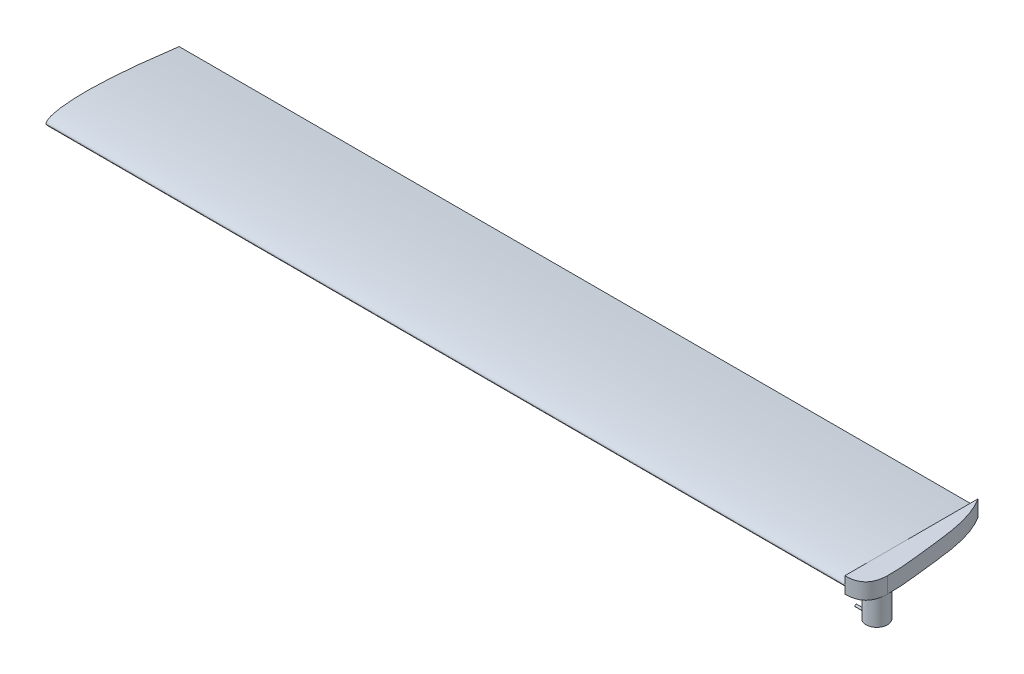
ISO-10303-21;
HEADER;
FILE_DESCRIPTION(('STEP AP214'),'2;1');
FILE_NAME('part.step','',(''),(''),'','','');
FILE_SCHEMA(('AUTOMOTIVE_DESIGN { 1 0 10303 214 1 1 1 1 }'));
ENDSEC;
DATA;
#1=APPLICATION_CONTEXT('core data for automotive mechanical design processes');
#2=APPLICATION_PROTOCOL_DEFINITION('international standard','automotive_design',2000,#1);
#3=PRODUCT_CONTEXT('',#1,'mechanical');
#4=PRODUCT('Part','Part','',(#3));
#5=PRODUCT_RELATED_PRODUCT_CATEGORY('part','',(#4));
#6=PRODUCT_DEFINITION_FORMATION('','',#4);
#7=PRODUCT_DEFINITION_CONTEXT('part definition',#1,'design');
#8=PRODUCT_DEFINITION('design','',#6,#7);
#9=PRODUCT_DEFINITION_SHAPE('','',#8);
#10=(LENGTH_UNIT() NAMED_UNIT(*) SI_UNIT(.MILLI.,.METRE.));
#11=(NAMED_UNIT(*) PLANE_ANGLE_UNIT() SI_UNIT($,.RADIAN.));
#12=(NAMED_UNIT(*) SI_UNIT($,.STERADIAN.) SOLID_ANGLE_UNIT());
#13=UNCERTAINTY_MEASURE_WITH_UNIT(LENGTH_MEASURE(1.E-05),#10,'distance_accuracy_value','');
#14=(GEOMETRIC_REPRESENTATION_CONTEXT(3) GLOBAL_UNCERTAINTY_ASSIGNED_CONTEXT((#13)) GLOBAL_UNIT_ASSIGNED_CONTEXT((#10,
#11,#12)) REPRESENTATION_CONTEXT('',''));
#15=CARTESIAN_POINT('',(0.,0.,0.));
#16=DIRECTION('',(0.,0.,1.));
#17=DIRECTION('',(1.,0.,0.));
#18=AXIS2_PLACEMENT_3D('',#15,#16,#17);
#19=CARTESIAN_POINT('',(750.,7.69748541026481,-124.995841148639));
#20=CARTESIAN_POINT('',(750.,8.13297079806969,-121.549441339967));
#21=CARTESIAN_POINT('',(750.,8.8711094317515,-115.707865670304));
#22=CARTESIAN_POINT('',(750.,10.001168495884,-106.612829462784));
#23=CARTESIAN_POINT('',(750.,10.900080960327,-98.7766774485687));
#24=CARTESIAN_POINT('',(750.,11.7180797430692,-91.0104309827742));
#25=CARTESIAN_POINT('',(750.,12.374421583348,-84.4661711660079));
#26=CARTESIAN_POINT('',(750.,13.0108919100097,-77.1231270334049));
#27=CARTESIAN_POINT('',(750.,13.6615586610674,-70.096902966347));
#28=CARTESIAN_POINT('',(750.,14.0382624320619,-63.2321869691896));
#29=CARTESIAN_POINT('',(750.,14.4586464854716,-56.9511833567442));
#30=CARTESIAN_POINT('',(750.,14.7447792836539,-50.1830543119707));
#31=CARTESIAN_POINT('',(750.,14.9288477277546,-43.7131494322692));
#32=CARTESIAN_POINT('',(750.,14.9867694495661,-38.0167473663419));
#33=CARTESIAN_POINT('',(750.,14.9641673572682,-31.8671085177231));
#34=CARTESIAN_POINT('',(750.,14.7641718889759,-25.9611084011886));
#35=CARTESIAN_POINT('',(750.,14.3189228100668,-20.4184783683121));
#36=CARTESIAN_POINT('',(750.,13.9020772787466,-16.0808939192611));
#37=CARTESIAN_POINT('',(750.,13.2766805127196,-11.948417440773));
#38=CARTESIAN_POINT('',(750.,12.4387478677314,-7.87202213430819));
#39=CARTESIAN_POINT('',(750.,11.4815907628938,-4.55145990959005));
#40=CARTESIAN_POINT('',(750.,10.1896156908138,-1.93507828303653));
#41=CARTESIAN_POINT('',(750.,8.86775259773538,-0.419790589282026));
#42=CARTESIAN_POINT('',(750.,7.67644804525767,0.11632820232294));
#43=CARTESIAN_POINT('',(750.,6.57571630783656,-0.228543288672665));
#44=CARTESIAN_POINT('',(750.,5.38282804272362,-1.09205976929891));
#45=CARTESIAN_POINT('',(750.,4.18267580665148,-3.12132983163146));
#46=CARTESIAN_POINT('',(750.,3.12236016112023,-5.83394586751756));
#47=CARTESIAN_POINT('',(750.,2.33803973933592,-8.96942484585597));
#48=CARTESIAN_POINT('',(750.,1.63555506566896,-12.4549344479186));
#49=CARTESIAN_POINT('',(750.,1.0576222452614,-16.3980412905516));
#50=CARTESIAN_POINT('',(750.,0.619305341649041,-20.4073734698152));
#51=CARTESIAN_POINT('',(750.,0.31851410484638,-24.9404968445985));
#52=CARTESIAN_POINT('',(750.,0.0979146932351296,-28.9969109003526));
#53=CARTESIAN_POINT('',(750.,0.0649508194327663,-33.6403576750407));
#54=CARTESIAN_POINT('',(750.,-0.00877400175199696,-37.6198248379226));
#55=CARTESIAN_POINT('',(750.,0.015166900275881,-42.1302311610639));
#56=CARTESIAN_POINT('',(750.,0.12809961974748,-46.8254786090486));
#57=CARTESIAN_POINT('',(750.,0.308197082911385,-52.0592292594811));
#58=CARTESIAN_POINT('',(750.,0.566048003035137,-57.5702731705481));
#59=CARTESIAN_POINT('',(750.,0.903534980744857,-63.0665569396856));
#60=CARTESIAN_POINT('',(750.,1.27356010427155,-68.7815874397308));
#61=CARTESIAN_POINT('',(750.,1.70119585281695,-74.2410513997578));
#62=CARTESIAN_POINT('',(750.,2.13196813018693,-79.3320789909935));
#63=CARTESIAN_POINT('',(750.,2.52583779535599,-83.7651352480584));
#64=CARTESIAN_POINT('',(750.,3.01497217512738,-88.3338625479964));
#65=CARTESIAN_POINT('',(750.,3.49549121200945,-93.4518819084549));
#66=CARTESIAN_POINT('',(750.,4.03066318219639,-98.4485149275409));
#67=CARTESIAN_POINT('',(750.,4.55967089304909,-103.359945305802));
#68=CARTESIAN_POINT('',(750.,5.05105140142525,-107.534749069242));
#69=CARTESIAN_POINT('',(750.,5.65258932830013,-112.036034411145));
#70=CARTESIAN_POINT('',(750.,6.20511451438241,-116.898948087647));
#71=CARTESIAN_POINT('',(750.,6.89818955039857,-121.185254011004));
#72=CARTESIAN_POINT('',(750.,7.13557750543474,-124.034905271131));
#73=CARTESIAN_POINT('',(750.,7.32673022277285,-124.871587069256));
#74=CARTESIAN_POINT('',(750.,7.3551179622547,-124.995841148639));
#75=B_SPLINE_CURVE_WITH_KNOTS('',3,(#19,#20,#21,#22,#23,#24,#25,#26,#27,#28,#29,#30,#31,#32,#33,
#34,#35,#36,#37,#38,#39,#40,#41,#42,#43,#44,#45,#46,#47,#48,#49,#50,#51,#52,#53,#54,#55,#56,#57,
#58,#59,#60,#61,#62,#63,#64,#65,#66,#67,#68,#69,#70,#71,#72,#73,#74),.UNSPECIFIED.,.F.,.F.,(4,1,
1,1,1,1,1,1,1,1,1,1,1,1,1,1,1,1,1,1,1,1,1,1,1,1,1,1,1,1,1,1,1,1,1,1,1,1,1,1,1,1,1,1,1,1,1,1,1,1,
1,1,1,4),(0.,0.0409096927672382,0.069341074509443,0.107932085318759,0.13379571453232,
0.16130729717174,0.185385503767664,0.220597865919934,0.244393633444343,0.266343568343719,
0.294730889223809,0.324163187557855,0.342565083334242,0.361815516183744,0.396586444452688,
0.412117027739434,0.427295280855564,0.447896389869057,0.461301180767998,0.476284913180007,
0.488528162874039,0.495261637278021,0.499815716845931,0.502760784822896,0.508369898484513,
0.516837025917484,0.529992214815813,0.542688858921217,0.554812189598935,0.571870003296213,
0.589595673628932,0.602296180079901,0.625369139144534,0.637420540621771,0.656976539844779,
0.672241266584835,0.690533980122457,0.712285020909276,0.733912637938034,0.755503976489473,
0.777133728985755,0.801356586058894,0.819993044264083,0.837303590830548,0.853766864034959,
0.874103184409616,0.897840615251757,0.912945775380075,0.93227821936547,0.947341946687704,
0.966428855971776,0.989896212666448,0.998499505073226,1.),.UNSPECIFIED.);
#76=DIRECTION('',(-1.,0.,0.));
#77=VECTOR('',#76,1.);
#78=SURFACE_OF_LINEAR_EXTRUSION('',#75,#77);
#79=CARTESIAN_POINT('',(0.,7.69748541026481,-124.995841148639));
#80=CARTESIAN_POINT('',(0.,8.13297079806969,-121.549441339967));
#81=CARTESIAN_POINT('',(0.,8.8711094317515,-115.707865670304));
#82=CARTESIAN_POINT('',(0.,10.001168495884,-106.612829462784));
#83=CARTESIAN_POINT('',(0.,10.900080960327,-98.7766774485687));
#84=CARTESIAN_POINT('',(0.,11.7180797430692,-91.0104309827742));
#85=CARTESIAN_POINT('',(0.,12.374421583348,-84.4661711660079));
#86=CARTESIAN_POINT('',(0.,13.0108919100097,-77.1231270334049));
#87=CARTESIAN_POINT('',(0.,13.6615586610674,-70.096902966347));
#88=CARTESIAN_POINT('',(0.,14.0382624320619,-63.2321869691896));
#89=CARTESIAN_POINT('',(0.,14.4586464854716,-56.9511833567442));
#90=CARTESIAN_POINT('',(0.,14.7447792836539,-50.1830543119707));
#91=CARTESIAN_POINT('',(0.,14.9288477277546,-43.7131494322692));
#92=CARTESIAN_POINT('',(0.,14.9867694495661,-38.0167473663419));
#93=CARTESIAN_POINT('',(0.,14.9641673572682,-31.8671085177231));
#94=CARTESIAN_POINT('',(0.,14.7641718889759,-25.9611084011886));
#95=CARTESIAN_POINT('',(0.,14.3189228100668,-20.4184783683121));
#96=CARTESIAN_POINT('',(0.,13.9020772787466,-16.0808939192611));
#97=CARTESIAN_POINT('',(0.,13.2766805127196,-11.948417440773));
#98=CARTESIAN_POINT('',(0.,12.4387478677314,-7.87202213430819));
#99=CARTESIAN_POINT('',(0.,11.4815907628938,-4.55145990959005));
#100=CARTESIAN_POINT('',(0.,10.1896156908138,-1.93507828303653));
#101=CARTESIAN_POINT('',(0.,8.86775259773538,-0.419790589282026));
#102=CARTESIAN_POINT('',(0.,7.67644804525767,0.11632820232294));
#103=CARTESIAN_POINT('',(0.,6.57571630783656,-0.228543288672665));
#104=CARTESIAN_POINT('',(0.,5.38282804272362,-1.09205976929891));
#105=CARTESIAN_POINT('',(0.,4.18267580665148,-3.12132983163146));
#106=CARTESIAN_POINT('',(0.,3.12236016112023,-5.83394586751756));
#107=CARTESIAN_POINT('',(0.,2.33803973933592,-8.96942484585597));
#108=CARTESIAN_POINT('',(0.,1.63555506566896,-12.4549344479186));
#109=CARTESIAN_POINT('',(0.,1.0576222452614,-16.3980412905516));
#110=CARTESIAN_POINT('',(0.,0.619305341649041,-20.4073734698152));
#111=CARTESIAN_POINT('',(0.,0.31851410484638,-24.9404968445985));
#112=CARTESIAN_POINT('',(0.,0.0979146932351296,-28.9969109003526));
#113=CARTESIAN_POINT('',(0.,0.0649508194327663,-33.6403576750407));
#114=CARTESIAN_POINT('',(0.,-0.00877400175199696,-37.6198248379226));
#115=CARTESIAN_POINT('',(0.,0.015166900275881,-42.1302311610639));
#116=CARTESIAN_POINT('',(0.,0.12809961974748,-46.8254786090486));
#117=CARTESIAN_POINT('',(0.,0.308197082911385,-52.0592292594811));
#118=CARTESIAN_POINT('',(0.,0.566048003035137,-57.5702731705481));
#119=CARTESIAN_POINT('',(0.,0.903534980744857,-63.0665569396856));
#120=CARTESIAN_POINT('',(0.,1.27356010427155,-68.7815874397308));
#121=CARTESIAN_POINT('',(0.,1.70119585281695,-74.2410513997578));
#122=CARTESIAN_POINT('',(0.,2.13196813018693,-79.3320789909935));
#123=CARTESIAN_POINT('',(0.,2.52583779535599,-83.7651352480584));
#124=CARTESIAN_POINT('',(0.,3.01497217512738,-88.3338625479964));
#125=CARTESIAN_POINT('',(0.,3.49549121200945,-93.4518819084549));
#126=CARTESIAN_POINT('',(0.,4.03066318219639,-98.4485149275409));
#127=CARTESIAN_POINT('',(0.,4.55967089304909,-103.359945305802));
#128=CARTESIAN_POINT('',(0.,5.05105140142525,-107.534749069242));
#129=CARTESIAN_POINT('',(0.,5.65258932830013,-112.036034411145));
#130=CARTESIAN_POINT('',(0.,6.20511451438241,-116.898948087647));
#131=CARTESIAN_POINT('',(0.,6.89818955039857,-121.185254011004));
#132=CARTESIAN_POINT('',(0.,7.13557750543474,-124.034905271131));
#133=CARTESIAN_POINT('',(0.,7.32673022277285,-124.871587069256));
#134=CARTESIAN_POINT('',(0.,7.3551179622547,-124.995841148639));
#135=B_SPLINE_CURVE_WITH_KNOTS('',3,(#79,#80,#81,#82,#83,#84,#85,#86,#87,#88,#89,#90,#91,#92,
#93,#94,#95,#96,#97,#98,#99,#100,#101,#102,#103,#104,#105,#106,#107,#108,#109,#110,#111,#112,
#113,#114,#115,#116,#117,#118,#119,#120,#121,#122,#123,#124,#125,#126,#127,#128,#129,#130,#131,
#132,#133,#134),.UNSPECIFIED.,.F.,.F.,(4,1,1,1,1,1,1,1,1,1,1,1,1,1,1,1,1,1,1,1,1,1,1,1,1,1,1,1,
1,1,1,1,1,1,1,1,1,1,1,1,1,1,1,1,1,1,1,1,1,1,1,1,1,4),(0.,0.0409096927672382,0.069341074509443,
0.107932085318759,0.13379571453232,0.16130729717174,0.185385503767664,0.220597865919934,
0.244393633444343,0.266343568343719,0.294730889223809,0.324163187557855,0.342565083334242,
0.361815516183744,0.396586444452688,0.412117027739434,0.427295280855564,0.447896389869057,
0.461301180767998,0.476284913180007,0.488528162874039,0.495261637278021,0.499815716845931,
0.502760784822896,0.508369898484513,0.516837025917484,0.529992214815813,0.542688858921217,
0.554812189598935,0.571870003296213,0.589595673628932,0.602296180079901,0.625369139144534,
0.637420540621771,0.656976539844779,0.672241266584835,0.690533980122457,0.712285020909276,
0.733912637938034,0.755503976489473,0.777133728985755,0.801356586058894,0.819993044264083,
0.837303590830548,0.853766864034959,0.874103184409616,0.897840615251757,0.912945775380075,
0.93227821936547,0.947341946687704,0.966428855971776,0.989896212666448,0.998499505073226,1.),.UNSPECIFIED.);
#136=CARTESIAN_POINT('',(0.,7.69748541026481,-124.995841148639));
#137=VERTEX_POINT('',#136);
#138=CARTESIAN_POINT('',(0.,7.3551179622547,-124.995841148639));
#139=VERTEX_POINT('',#138);
#140=EDGE_CURVE('E103',#137,#139,#135,.T.);
#141=ORIENTED_EDGE('',*,*,#140,.T.);
#142=DIRECTION('',(-1.,0.,0.));
#143=VECTOR('',#142,1.);
#144=CARTESIAN_POINT('',(750.,7.3551179622547,-124.995841148639));
#145=LINE('',#144,#143);
#146=CARTESIAN_POINT('',(750.,7.3551179622547,-124.995841148639));
#147=VERTEX_POINT('',#146);
#148=EDGE_CURVE('E11',#147,#139,#145,.T.);
#149=ORIENTED_EDGE('',*,*,#148,.F.);
#150=CARTESIAN_POINT('',(750.,7.69748541026481,-124.995841148639));
#151=CARTESIAN_POINT('',(750.,8.13297079806969,-121.549441339967));
#152=CARTESIAN_POINT('',(750.,8.8711094317515,-115.707865670304));
#153=CARTESIAN_POINT('',(750.,10.001168495884,-106.612829462784));
#154=CARTESIAN_POINT('',(750.,10.900080960327,-98.7766774485687));
#155=CARTESIAN_POINT('',(750.,11.7180797430692,-91.0104309827742));
#156=CARTESIAN_POINT('',(750.,12.374421583348,-84.4661711660079));
#157=CARTESIAN_POINT('',(750.,13.0108919100097,-77.1231270334049));
#158=CARTESIAN_POINT('',(750.,13.6615586610674,-70.096902966347));
#159=CARTESIAN_POINT('',(750.,14.0382624320619,-63.2321869691896));
#160=CARTESIAN_POINT('',(750.,14.4586464854716,-56.9511833567442));
#161=CARTESIAN_POINT('',(750.,14.7447792836539,-50.1830543119707));
#162=CARTESIAN_POINT('',(750.,14.9288477277546,-43.7131494322692));
#163=CARTESIAN_POINT('',(750.,14.9867694495661,-38.0167473663419));
#164=CARTESIAN_POINT('',(750.,14.9641673572682,-31.8671085177231));
#165=CARTESIAN_POINT('',(750.,14.7641718889759,-25.9611084011886));
#166=CARTESIAN_POINT('',(750.,14.3189228100668,-20.4184783683121));
#167=CARTESIAN_POINT('',(750.,13.9020772787466,-16.0808939192611));
#168=CARTESIAN_POINT('',(750.,13.2766805127196,-11.948417440773));
#169=CARTESIAN_POINT('',(750.,12.4387478677314,-7.87202213430819));
#170=CARTESIAN_POINT('',(750.,11.4815907628938,-4.55145990959005));
#171=CARTESIAN_POINT('',(750.,10.1896156908138,-1.93507828303653));
#172=CARTESIAN_POINT('',(750.,8.86775259773538,-0.419790589282026));
#173=CARTESIAN_POINT('',(750.,7.67644804525767,0.11632820232294));
#174=CARTESIAN_POINT('',(750.,6.57571630783656,-0.228543288672665));
#175=CARTESIAN_POINT('',(750.,5.38282804272362,-1.09205976929891));
#176=CARTESIAN_POINT('',(750.,4.18267580665148,-3.12132983163146));
#177=CARTESIAN_POINT('',(750.,3.12236016112023,-5.83394586751756));
#178=CARTESIAN_POINT('',(750.,2.33803973933592,-8.96942484585597));
#179=CARTESIAN_POINT('',(750.,1.63555506566896,-12.4549344479186));
#180=CARTESIAN_POINT('',(750.,1.0576222452614,-16.3980412905516));
#181=CARTESIAN_POINT('',(750.,0.619305341649041,-20.4073734698152));
#182=CARTESIAN_POINT('',(750.,0.31851410484638,-24.9404968445985));
#183=CARTESIAN_POINT('',(750.,0.0979146932351296,-28.9969109003526));
#184=CARTESIAN_POINT('',(750.,0.0649508194327663,-33.6403576750407));
#185=CARTESIAN_POINT('',(750.,-0.00877400175199696,-37.6198248379226));
#186=CARTESIAN_POINT('',(750.,0.015166900275881,-42.1302311610639));
#187=CARTESIAN_POINT('',(750.,0.12809961974748,-46.8254786090486));
#188=CARTESIAN_POINT('',(750.,0.308197082911385,-52.0592292594811));
#189=CARTESIAN_POINT('',(750.,0.566048003035137,-57.5702731705481));
#190=CARTESIAN_POINT('',(750.,0.903534980744857,-63.0665569396856));
#191=CARTESIAN_POINT('',(750.,1.27356010427155,-68.7815874397308));
#192=CARTESIAN_POINT('',(750.,1.70119585281695,-74.2410513997578));
#193=CARTESIAN_POINT('',(750.,2.13196813018693,-79.3320789909935));
#194=CARTESIAN_POINT('',(750.,2.52583779535599,-83.7651352480584));
#195=CARTESIAN_POINT('',(750.,3.01497217512738,-88.3338625479964));
#196=CARTESIAN_POINT('',(750.,3.49549121200945,-93.4518819084549));
#197=CARTESIAN_POINT('',(750.,4.03066318219639,-98.4485149275409));
#198=CARTESIAN_POINT('',(750.,4.55967089304909,-103.359945305802));
#199=CARTESIAN_POINT('',(750.,5.05105140142525,-107.534749069242));
#200=CARTESIAN_POINT('',(750.,5.65258932830013,-112.036034411145));
#201=CARTESIAN_POINT('',(750.,6.20511451438241,-116.898948087647));
#202=CARTESIAN_POINT('',(750.,6.89818955039857,-121.185254011004));
#203=CARTESIAN_POINT('',(750.,7.13557750543474,-124.034905271131));
#204=CARTESIAN_POINT('',(750.,7.32673022277285,-124.871587069256));
#205=CARTESIAN_POINT('',(750.,7.3551179622547,-124.995841148639));
#206=B_SPLINE_CURVE_WITH_KNOTS('',3,(#150,#151,#152,#153,#154,#155,#156,#157,#158,#159,#160,
#161,#162,#163,#164,#165,#166,#167,#168,#169,#170,#171,#172,#173,#174,#175,#176,#177,#178,#179,
#180,#181,#182,#183,#184,#185,#186,#187,#188,#189,#190,#191,#192,#193,#194,#195,#196,#197,#198,
#199,#200,#201,#202,#203,#204,#205),.UNSPECIFIED.,.F.,.F.,(4,1,1,1,1,1,1,1,1,1,1,1,1,1,1,1,1,1,
1,1,1,1,1,1,1,1,1,1,1,1,1,1,1,1,1,1,1,1,1,1,1,1,1,1,1,1,1,1,1,1,1,1,1,4),(0.,0.0409096927672382,
0.069341074509443,0.107932085318759,0.13379571453232,0.16130729717174,0.185385503767664,
0.220597865919934,0.244393633444343,0.266343568343719,0.294730889223809,0.324163187557855,
0.342565083334242,0.361815516183744,0.396586444452688,0.412117027739434,0.427295280855564,
0.447896389869057,0.461301180767998,0.476284913180007,0.488528162874039,0.495261637278021,
0.499815716845931,0.502760784822896,0.508369898484513,0.516837025917484,0.529992214815813,
0.542688858921217,0.554812189598935,0.571870003296213,0.589595673628932,0.602296180079901,
0.625369139144534,0.637420540621771,0.656976539844779,0.672241266584835,0.690533980122457,
0.712285020909276,0.733912637938034,0.755503976489473,0.777133728985755,0.801356586058894,
0.819993044264083,0.837303590830548,0.853766864034959,0.874103184409616,0.897840615251757,
0.912945775380075,0.93227821936547,0.947341946687704,0.966428855971776,0.989896212666448,
0.998499505073226,1.),.UNSPECIFIED.);
#207=CARTESIAN_POINT('',(750.,7.55858231577542,0.000123715142924602));
#208=VERTEX_POINT('',#207);
#209=EDGE_CURVE('E60',#208,#147,#206,.T.);
#210=ORIENTED_EDGE('',*,*,#209,.F.);
#211=CARTESIAN_POINT('',(750.,7.69748541026481,-124.995841148639));
#212=VERTEX_POINT('',#211);
#213=EDGE_CURVE('E45',#212,#208,#206,.T.);
#214=ORIENTED_EDGE('',*,*,#213,.F.);
#215=DIRECTION('',(-1.,0.,0.));
#216=VECTOR('',#215,1.);
#217=CARTESIAN_POINT('',(750.,7.69748541026481,-124.995841148639));
#218=LINE('',#217,#216);
#219=EDGE_CURVE('E52',#212,#137,#218,.T.);
#220=ORIENTED_EDGE('',*,*,#219,.T.);
#221=EDGE_LOOP('',(#141,#149,#210,#214,#220));
#222=FACE_BOUND('',#221,.T.);
#223=ADVANCED_FACE('F41',(#222),#78,.F.);
#224=CARTESIAN_POINT('',(750.,7.69748541026481,-124.995841148639));
#225=DIRECTION('',(0.,0.,1.));
#226=DIRECTION('',(1.,0.,0.));
#227=AXIS2_PLACEMENT_3D('',#224,#225,#226);
#228=PLANE('',#227);
#229=DIRECTION('',(0.,1.,0.));
#230=VECTOR('',#229,1.);
#231=CARTESIAN_POINT('',(0.,7.69748541026481,-124.995841148639));
#232=LINE('',#231,#230);
#233=EDGE_CURVE('E109',#139,#137,#232,.T.);
#234=ORIENTED_EDGE('',*,*,#233,.T.);
#235=ORIENTED_EDGE('',*,*,#219,.F.);
#236=DIRECTION('',(0.,1.,0.));
#237=VECTOR('',#236,1.);
#238=CARTESIAN_POINT('',(750.,7.69748541026481,-124.995841148639));
#239=LINE('',#238,#237);
#240=EDGE_CURVE('E68',#147,#212,#239,.T.);
#241=ORIENTED_EDGE('',*,*,#240,.F.);
#242=ORIENTED_EDGE('',*,*,#148,.T.);
#243=EDGE_LOOP('',(#234,#235,#241,#242));
#244=FACE_BOUND('',#243,.T.);
#245=ADVANCED_FACE('F115',(#244),#228,.F.);
#246=CARTESIAN_POINT('',(760.,-25.,-19.9998762848548));
#247=DIRECTION('',(0.,1.,0.));
#248=DIRECTION('',(0.,0.,1.));
#249=AXIS2_PLACEMENT_3D('',#246,#247,#248);
#250=CYLINDRICAL_SURFACE('',#249,10.);
#251=CARTESIAN_POINT('',(760.,0.,-19.9998762848548));
#252=DIRECTION('',(0.,1.,0.));
#253=DIRECTION('',(0.,0.,-1.));
#254=AXIS2_PLACEMENT_3D('',#251,#252,#253);
#255=CIRCLE('',#254,10.);
#256=CARTESIAN_POINT('',(750.,0.,-19.9998762848548));
#257=VERTEX_POINT('',#256);
#258=CARTESIAN_POINT('',(769.98974573257,0.,-19.5471288954676));
#259=VERTEX_POINT('',#258);
#260=EDGE_CURVE('E227',#257,#259,#255,.T.);
#261=ORIENTED_EDGE('',*,*,#260,.F.);
#262=CARTESIAN_POINT('',(760.,0.,-19.9998762848548));
#263=DIRECTION('',(0.,-1.,0.));
#264=DIRECTION('',(0.,0.,1.));
#265=AXIS2_PLACEMENT_3D('',#262,#263,#264);
#266=CIRCLE('',#265,10.);
#267=CARTESIAN_POINT('',(770.,0.,-19.9998762848548));
#268=VERTEX_POINT('',#267);
#269=EDGE_CURVE('E110',#268,#257,#266,.F.);
#270=ORIENTED_EDGE('',*,*,#269,.F.);
#271=CARTESIAN_POINT('',(769.98974573257,0.,-19.5471288954677));
#272=CARTESIAN_POINT('',(769.996082132615,0.,-19.7722071167071));
#273=CARTESIAN_POINT('',(770.,0.,-19.9998762848548));
#274=B_SPLINE_CURVE_WITH_KNOTS('',2,(#271,#272,#273),.UNSPECIFIED.,.F.,.F.,(3,3),
(0.988805697326735,1.),.UNSPECIFIED.);
#275=EDGE_CURVE('E202',#259,#268,#274,.T.);
#276=ORIENTED_EDGE('',*,*,#275,.F.);
#277=EDGE_LOOP('',(#261,#270,#276));
#278=FACE_BOUND('',#277,.T.);
#279=CARTESIAN_POINT('',(760.,-25.,-19.9998762848548));
#280=DIRECTION('',(0.,1.,0.));
#281=DIRECTION('',(0.,0.,-1.));
#282=AXIS2_PLACEMENT_3D('',#279,#280,#281);
#283=CIRCLE('',#282,10.);
#284=CARTESIAN_POINT('',(750.,-25.,-19.9998762848548));
#285=VERTEX_POINT('',#284);
#286=EDGE_CURVE('E232',#285,#285,#283,.T.);
#287=ORIENTED_EDGE('',*,*,#286,.T.);
#288=CARTESIAN_POINT('',(750.050125628934,-24.,-20.9998762848549));
#289=CARTESIAN_POINT('',(750.050124972031,-23.9439804358264,-20.9998738582484));
#290=CARTESIAN_POINT('',(750.049647430058,-23.8879238315882,-20.9951531438373));
#291=CARTESIAN_POINT('',(750.047789124419,-23.7773648137065,-20.9763925996184));
#292=CARTESIAN_POINT('',(750.046407365388,-23.7228641819625,-20.9623424997413));
#293=CARTESIAN_POINT('',(750.042898669526,-23.6170341807821,-20.9253364009238));
#294=CARTESIAN_POINT('',(750.040772184532,-23.5657029106086,-20.9023858011488));
#295=CARTESIAN_POINT('',(750.036014194282,-23.4676322077083,-20.848240552246));
#296=CARTESIAN_POINT('',(750.033382789357,-23.4208918655163,-20.8170475404808));
#297=CARTESIAN_POINT('',(750.027900732901,-23.3331487363425,-20.7471810468536));
#298=CARTESIAN_POINT('',(750.025049399947,-23.2921649904962,-20.7084837029631));
#299=CARTESIAN_POINT('',(750.019454947643,-23.2172623909964,-20.6247580001744));
#300=CARTESIAN_POINT('',(750.016711833248,-23.1833438605937,-20.5797293517614));
#301=CARTESIAN_POINT('',(750.011636168444,-23.1234687429928,-20.4845026465058));
#302=CARTESIAN_POINT('',(750.009304491054,-23.0975290012063,-20.4342939473844));
#303=CARTESIAN_POINT('',(750.005321831242,-23.0544555668513,-20.3302062691424));
#304=CARTESIAN_POINT('',(750.003670832229,-23.0373216596305,-20.2763273795231));
#305=CARTESIAN_POINT('',(750.00124033429,-23.0124020906468,-20.1666210675978));
#306=CARTESIAN_POINT('',(750.000457921572,-23.0045851672501,-20.1108008118864));
#307=CARTESIAN_POINT('',(749.999842844013,-22.9984247308663,-19.9986355441659));
#308=CARTESIAN_POINT('',(750.000010154547,-23.0000809722537,-19.9422905458004));
#309=CARTESIAN_POINT('',(750.001273286888,-23.0127944726502,-19.8308874407903));
#310=CARTESIAN_POINT('',(750.002365788483,-23.0238181155639,-19.7758254549199));
#311=CARTESIAN_POINT('',(750.005352707351,-23.0549011289466,-19.6683371053503));
#312=CARTESIAN_POINT('',(750.007247135041,-23.0749606167876,-19.6159107758971));
#313=CARTESIAN_POINT('',(750.011630625161,-23.1235827632544,-19.5150759701753));
#314=CARTESIAN_POINT('',(750.014120726342,-23.1521602975302,-19.4666747138732));
#315=CARTESIAN_POINT('',(750.019416154806,-23.2169965233364,-19.3753427716807));
#316=CARTESIAN_POINT('',(750.022221491332,-23.2532554401452,-19.332412246294));
#317=CARTESIAN_POINT('',(750.027847065321,-23.3326142295136,-19.2530435130322));
#318=CARTESIAN_POINT('',(750.03066731427,-23.3757433447416,-19.2166345386645));
#319=CARTESIAN_POINT('',(750.035992600718,-23.4675168652108,-19.1515687494969));
#320=CARTESIAN_POINT('',(750.03849763776,-23.5161612784521,-19.122911945942));
#321=CARTESIAN_POINT('',(750.042909104858,-23.6176070251998,-19.0741641002816));
#322=CARTESIAN_POINT('',(750.044815408674,-23.6704092324229,-19.0540748642819));
#323=CARTESIAN_POINT('',(750.047810981291,-23.7786606046147,-19.0230555492173));
#324=CARTESIAN_POINT('',(750.048900274982,-23.8341096888874,-19.0121251911118));
#325=CARTESIAN_POINT('',(750.050134194726,-23.9458241795295,-18.9997715094629));
#326=CARTESIAN_POINT('',(750.050282884524,-24.0020850202648,-18.9983072882076));
#327=CARTESIAN_POINT('',(750.049629486452,-24.1140512658229,-19.0048200379835));
#328=CARTESIAN_POINT('',(750.048827411429,-24.1697566781404,-19.0127968814451));
#329=CARTESIAN_POINT('',(750.046366555776,-24.2789115822783,-19.0379311103473));
#330=CARTESIAN_POINT('',(750.044709579986,-24.3323655710947,-19.0550691576659));
#331=CARTESIAN_POINT('',(750.040727089612,-24.4356400517303,-19.0980195651789));
#332=CARTESIAN_POINT('',(750.038401559713,-24.4854604602872,-19.1238321240713));
#333=CARTESIAN_POINT('',(750.033334156443,-24.5802399740288,-19.1835012834316));
#334=CARTESIAN_POINT('',(750.030590891853,-24.6251819419663,-19.2173849850142));
#335=CARTESIAN_POINT('',(750.025001673748,-24.7087550532741,-19.2921957514037));
#336=CARTESIAN_POINT('',(750.022155717691,-24.7473860403401,-19.3331229906067));
#337=CARTESIAN_POINT('',(750.016669521507,-24.8173816333981,-19.4210364806284));
#338=CARTESIAN_POINT('',(750.014030059445,-24.8487195595862,-19.4680440288854));
#339=CARTESIAN_POINT('',(750.009265578934,-24.9030558685064,-19.5666785674377));
#340=CARTESIAN_POINT('',(750.007140553435,-24.9260543655071,-19.6183054944252));
#341=CARTESIAN_POINT('',(750.00364789586,-24.9630137676553,-19.724620158422));
#342=CARTESIAN_POINT('',(750.002278913944,-24.9769907873252,-19.7793022472049));
#343=CARTESIAN_POINT('',(750.000447053863,-24.9955630695798,-19.8902514708712));
#344=CARTESIAN_POINT('',(749.999984150234,-25.000158595834,-19.9465185611626));
#345=CARTESIAN_POINT('',(750.000016616867,-24.9998337335601,-20.0587785089306));
#346=CARTESIAN_POINT('',(750.000507816233,-24.9949547631633,-20.1147714920794));
#347=CARTESIAN_POINT('',(750.002385064224,-24.975906254343,-20.2251381732112));
#348=CARTESIAN_POINT('',(750.003771113551,-24.961736708627,-20.2795118699232));
#349=CARTESIAN_POINT('',(750.00728276186,-24.9245207426071,-20.3850961936226));
#350=CARTESIAN_POINT('',(750.009408259968,-24.9014755330658,-20.4363072509324));
#351=CARTESIAN_POINT('',(750.014161875837,-24.847166831083,-20.5341408850097));
#352=CARTESIAN_POINT('',(750.016789990658,-24.8159033867289,-20.5807634886234));
#353=CARTESIAN_POINT('',(750.022268153309,-24.7458903809762,-20.6683090092818));
#354=CARTESIAN_POINT('',(750.025119085393,-24.7071099837552,-20.7092072110742));
#355=CARTESIAN_POINT('',(750.030714092303,-24.6232246484545,-20.783934044248));
#356=CARTESIAN_POINT('',(750.033458141322,-24.5781181948309,-20.8177609767027));
#357=CARTESIAN_POINT('',(750.038536165894,-24.4827356580801,-20.8774529252789));
#358=CARTESIAN_POINT('',(750.040869080747,-24.4324467186759,-20.9032974728497));
#359=CARTESIAN_POINT('',(750.044848052375,-24.3282517087538,-20.9461409929536));
#360=CARTESIAN_POINT('',(750.046494883466,-24.2743497960743,-20.9631499427447));
#361=CARTESIAN_POINT('',(750.048499924619,-24.1834522591009,-20.9835979731884));
#362=CARTESIAN_POINT('',(750.049106680643,-24.1470377486936,-20.9896939972531));
#363=CARTESIAN_POINT('',(750.049919748223,-24.0737541769574,-20.99783394346));
#364=CARTESIAN_POINT('',(750.05012606146,-24.0368851175374,-20.9998778826121));
#365=CARTESIAN_POINT('',(750.050125628934,-24.,-20.9998762848549));
#366=B_SPLINE_CURVE_WITH_KNOTS('',3,(#288,#289,#290,#291,#292,#293,#294,#295,#296,#297,#298,
#299,#300,#301,#302,#303,#304,#305,#306,#307,#308,#309,#310,#311,#312,#313,#314,#315,#316,#317,
#318,#319,#320,#321,#322,#323,#324,#325,#326,#327,#328,#329,#330,#331,#332,#333,#334,#335,#336,
#337,#338,#339,#340,#341,#342,#343,#344,#345,#346,#347,#348,#349,#350,#351,#352,#353,#354,#355,
#356,#357,#358,#359,#360,#361,#362,#363,#364,#365),.UNSPECIFIED.,.T.,.F.,(4,2,2,2,2,2,2,2,2,2,2,
2,2,2,2,2,2,2,2,2,2,2,2,2,2,2,2,2,2,2,2,2,2,2,2,2,2,2,4),(0.,0.16792399443646,0.33603315182177,
0.504040490997464,0.672014480421313,0.840531615299243,1.00905645855253,1.17793469971292,
1.34680882407795,1.5151147089845,1.68341622998233,1.85111631818662,2.01881858480975,
2.18681545466414,2.35481725218529,2.52355425085001,2.69229149427563,2.86106429117934,
3.02983194595033,3.19786996307766,3.36590570966871,3.53358814704528,3.70127442561048,
3.86953189811719,4.03779353723203,4.20666136818118,4.37552688518005,4.54408992694362,
4.7126482311315,4.88047133468484,5.04829456996659,5.21609491995247,5.383894288108,
5.55239715037991,5.72094045034526,5.88991241070478,6.05869314894002,6.16926027606047,
6.27982693903816),.UNSPECIFIED.);
#367=EDGE_CURVE('E397',#285,#285,#366,.T.);
#368=ORIENTED_EDGE('',*,*,#367,.T.);
#369=EDGE_LOOP('',(#287,#368));
#370=FACE_BOUND('',#369,.T.);
#371=ADVANCED_FACE('F117',(#278,#370),#250,.T.);
#372=CARTESIAN_POINT('',(750.,0.,0.));
#373=DIRECTION('',(0.,1.,0.));
#374=DIRECTION('',(0.,0.,1.));
#375=AXIS2_PLACEMENT_3D('',#372,#373,#374);
#376=PLANE('',#375);
#377=ORIENTED_EDGE('',*,*,#269,.T.);
#378=DIRECTION('',(0.,0.,1.));
#379=VECTOR('',#378,1.);
#380=CARTESIAN_POINT('',(750.,0.,0.));
#381=LINE('',#380,#379);
#382=CARTESIAN_POINT('',(750.,0.,-124.995841148639));
#383=VERTEX_POINT('',#382);
#384=EDGE_CURVE('E143',#383,#257,#381,.T.);
#385=ORIENTED_EDGE('',*,*,#384,.F.);
#386=CARTESIAN_POINT('',(770.,0.,-19.9998762848548));
#387=CARTESIAN_POINT('',(770.25649122117,0.,-33.605237108374));
#388=CARTESIAN_POINT('',(765.141746560801,0.,-69.2209750979923));
#389=CARTESIAN_POINT('',(762.666672021234,0.,-105.011543661617));
#390=CARTESIAN_POINT('',(750.,0.,-124.995841148639));
#391=B_SPLINE_CURVE_WITH_KNOTS('',3,(#386,#387,#388,#389,#390),.UNSPECIFIED.,.F.,.F.,(4,1,4),
(0.,0.363918554591473,1.),.UNSPECIFIED.);
#392=EDGE_CURVE('E205',#268,#383,#391,.T.);
#393=ORIENTED_EDGE('',*,*,#392,.F.);
#394=EDGE_LOOP('',(#377,#385,#393));
#395=FACE_BOUND('',#394,.T.);
#396=ADVANCED_FACE('F122',(#395),#376,.F.);
#397=CARTESIAN_POINT('',(750.,15.,0.));
#398=DIRECTION('',(-1.,0.,0.));
#399=DIRECTION('',(0.,0.,-1.));
#400=AXIS2_PLACEMENT_3D('',#397,#398,#399);
#401=PLANE('',#400);
#402=ORIENTED_EDGE('',*,*,#213,.T.);
#403=DIRECTION('',(0.,-1.,0.));
#404=VECTOR('',#403,1.);
#405=CARTESIAN_POINT('',(750.,15.,0.000123715145150439));
#406=LINE('',#405,#404);
#407=CARTESIAN_POINT('',(750.,15.,0.000123715145150439));
#408=VERTEX_POINT('',#407);
#409=EDGE_CURVE('E180',#408,#208,#406,.T.);
#410=ORIENTED_EDGE('',*,*,#409,.F.);
#411=DIRECTION('',(0.,0.,1.));
#412=VECTOR('',#411,1.);
#413=CARTESIAN_POINT('',(750.,15.,0.));
#414=LINE('',#413,#412);
#415=CARTESIAN_POINT('',(750.,15.,-124.995841148639));
#416=VERTEX_POINT('',#415);
#417=EDGE_CURVE('E155',#416,#408,#414,.T.);
#418=ORIENTED_EDGE('',*,*,#417,.F.);
#419=DIRECTION('',(0.,-1.,0.));
#420=VECTOR('',#419,1.);
#421=CARTESIAN_POINT('',(750.,15.,-124.995841148639));
#422=LINE('',#421,#420);
#423=EDGE_CURVE('E167',#416,#212,#422,.T.);
#424=ORIENTED_EDGE('',*,*,#423,.T.);
#425=EDGE_LOOP('',(#402,#410,#418,#424));
#426=FACE_BOUND('',#425,.T.);
#427=ADVANCED_FACE('F265',(#426),#401,.T.);
#428=ORIENTED_EDGE('',*,*,#209,.T.);
#429=EDGE_CURVE('E162',#147,#383,#422,.T.);
#430=ORIENTED_EDGE('',*,*,#429,.T.);
#431=ORIENTED_EDGE('',*,*,#384,.T.);
#432=CARTESIAN_POINT('',(750.,0.,0.000123715145150439));
#433=VERTEX_POINT('',#432);
#434=EDGE_CURVE('E166',#257,#433,#381,.T.);
#435=ORIENTED_EDGE('',*,*,#434,.T.);
#436=EDGE_CURVE('E171',#208,#433,#406,.T.);
#437=ORIENTED_EDGE('',*,*,#436,.F.);
#438=EDGE_LOOP('',(#428,#430,#431,#435,#437));
#439=FACE_BOUND('',#438,.T.);
#440=ADVANCED_FACE('F131',(#439),#401,.T.);
#441=CARTESIAN_POINT('',(770.,15.,-19.9998762848548));
#442=CARTESIAN_POINT('',(770.25649122117,15.,-33.605237108374));
#443=CARTESIAN_POINT('',(765.141746560801,15.,-69.2209750979923));
#444=CARTESIAN_POINT('',(762.666672021234,15.,-105.011543661617));
#445=CARTESIAN_POINT('',(750.,15.,-124.995841148639));
#446=B_SPLINE_CURVE_WITH_KNOTS('',3,(#441,#442,#443,#444,#445),.UNSPECIFIED.,.F.,.F.,(4,1,4),
(0.,0.363918554591473,1.),.UNSPECIFIED.);
#447=DIRECTION('',(0.,-1.,0.));
#448=VECTOR('',#447,1.);
#449=SURFACE_OF_LINEAR_EXTRUSION('',#446,#448);
#450=ORIENTED_EDGE('',*,*,#392,.T.);
#451=ORIENTED_EDGE('',*,*,#429,.F.);
#452=ORIENTED_EDGE('',*,*,#240,.T.);
#453=ORIENTED_EDGE('',*,*,#423,.F.);
#454=CARTESIAN_POINT('',(770.,15.,-19.9998762848548));
#455=VERTEX_POINT('',#454);
#456=EDGE_CURVE('E136',#455,#416,#446,.T.);
#457=ORIENTED_EDGE('',*,*,#456,.F.);
#458=DIRECTION('',(0.,-1.,0.));
#459=VECTOR('',#458,1.);
#460=CARTESIAN_POINT('',(770.,15.,-19.9998762848548));
#461=LINE('',#460,#459);
#462=EDGE_CURVE('E183',#455,#268,#461,.T.);
#463=ORIENTED_EDGE('',*,*,#462,.T.);
#464=EDGE_LOOP('',(#450,#451,#452,#453,#457,#463));
#465=FACE_BOUND('',#464,.T.);
#466=ADVANCED_FACE('F126',(#465),#449,.F.);
#467=CARTESIAN_POINT('',(750.,15.,0.000123715145150439));
#468=CARTESIAN_POINT('',(769.6500123769,15.,0.338073723545308));
#469=CARTESIAN_POINT('',(770.,15.,-19.9998762848548));
#470=B_SPLINE_CURVE_WITH_KNOTS('',2,(#467,#468,#469),.UNSPECIFIED.,.F.,.F.,(3,3),(0.,1.),.UNSPECIFIED.);
#471=DIRECTION('',(0.,-1.,0.));
#472=VECTOR('',#471,1.);
#473=SURFACE_OF_LINEAR_EXTRUSION('',#470,#472);
#474=CARTESIAN_POINT('',(750.,0.,0.000123715145150439));
#475=CARTESIAN_POINT('',(769.6500123769,0.,0.338073723545308));
#476=CARTESIAN_POINT('',(770.,0.,-19.9998762848548));
#477=B_SPLINE_CURVE_WITH_KNOTS('',2,(#474,#475,#476),.UNSPECIFIED.,.F.,.F.,(3,3),(0.,1.),.UNSPECIFIED.);
#478=EDGE_CURVE('E193',#433,#259,#477,.T.);
#479=ORIENTED_EDGE('',*,*,#478,.T.);
#480=ORIENTED_EDGE('',*,*,#275,.T.);
#481=ORIENTED_EDGE('',*,*,#462,.F.);
#482=EDGE_CURVE('E142',#408,#455,#470,.T.);
#483=ORIENTED_EDGE('',*,*,#482,.F.);
#484=ORIENTED_EDGE('',*,*,#409,.T.);
#485=ORIENTED_EDGE('',*,*,#436,.T.);
#486=EDGE_LOOP('',(#479,#480,#481,#483,#484,#485));
#487=FACE_BOUND('',#486,.T.);
#488=ADVANCED_FACE('F130',(#487),#473,.F.);
#489=CARTESIAN_POINT('',(750.,15.,0.));
#490=DIRECTION('',(0.,1.,0.));
#491=DIRECTION('',(0.,0.,1.));
#492=AXIS2_PLACEMENT_3D('',#489,#490,#491);
#493=PLANE('',#492);
#494=ORIENTED_EDGE('',*,*,#456,.T.);
#495=ORIENTED_EDGE('',*,*,#417,.T.);
#496=ORIENTED_EDGE('',*,*,#482,.T.);
#497=EDGE_LOOP('',(#494,#495,#496));
#498=FACE_BOUND('',#497,.T.);
#499=ADVANCED_FACE('F267',(#498),#493,.T.);
#500=ORIENTED_EDGE('',*,*,#260,.T.);
#501=ORIENTED_EDGE('',*,*,#478,.F.);
#502=ORIENTED_EDGE('',*,*,#434,.F.);
#503=EDGE_LOOP('',(#500,#501,#502));
#504=FACE_BOUND('',#503,.T.);
#505=ADVANCED_FACE('F269',(#504),#376,.F.);
#506=CARTESIAN_POINT('',(760.,-25.,-19.9998762848548));
#507=DIRECTION('',(0.,-1.,0.));
#508=DIRECTION('',(0.,0.,-1.));
#509=AXIS2_PLACEMENT_3D('',#506,#507,#508);
#510=PLANE('',#509);
#511=ORIENTED_EDGE('',*,*,#286,.F.);
#512=EDGE_LOOP('',(#511));
#513=FACE_BOUND('',#512,.T.);
#514=ADVANCED_FACE('F275',(#513),#510,.T.);
#515=CARTESIAN_POINT('',(740.5,-24.,-19.9998762848549));
#516=DIRECTION('',(1.,0.,0.));
#517=DIRECTION('',(0.,0.,1.));
#518=AXIS2_PLACEMENT_3D('',#515,#516,#517);
#519=CYLINDRICAL_SURFACE('',#518,1.);
#520=CARTESIAN_POINT('',(740.5,-24.,-19.9998762848549));
#521=DIRECTION('',(1.,0.,0.));
#522=DIRECTION('',(0.,0.,-1.));
#523=AXIS2_PLACEMENT_3D('',#520,#521,#522);
#524=CIRCLE('',#523,1.);
#525=CARTESIAN_POINT('',(740.5,-24.,-20.9998762848549));
#526=VERTEX_POINT('',#525);
#527=EDGE_CURVE('E403',#526,#526,#524,.T.);
#528=ORIENTED_EDGE('',*,*,#527,.T.);
#529=EDGE_LOOP('',(#528));
#530=FACE_BOUND('',#529,.T.);
#531=ORIENTED_EDGE('',*,*,#367,.F.);
#532=EDGE_LOOP('',(#531));
#533=FACE_BOUND('',#532,.T.);
#534=ADVANCED_FACE('F353',(#530,#533),#519,.T.);
#535=CARTESIAN_POINT('',(740.5,-24.,-19.9998762848549));
#536=DIRECTION('',(-1.,0.,0.));
#537=DIRECTION('',(0.,0.,-1.));
#538=AXIS2_PLACEMENT_3D('',#535,#536,#537);
#539=PLANE('',#538);
#540=ORIENTED_EDGE('',*,*,#527,.F.);
#541=EDGE_LOOP('',(#540));
#542=FACE_BOUND('',#541,.T.);
#543=ADVANCED_FACE('F361',(#542),#539,.T.);
#544=CARTESIAN_POINT('',(0.,15.,181.));
#545=DIRECTION('',(-1.,0.,0.));
#546=DIRECTION('',(0.,0.,1.));
#547=AXIS2_PLACEMENT_3D('',#544,#545,#546);
#548=PLANE('',#547);
#549=ORIENTED_EDGE('',*,*,#233,.F.);
#550=ORIENTED_EDGE('',*,*,#140,.F.);
#551=EDGE_LOOP('',(#549,#550));
#552=FACE_BOUND('',#551,.T.);
#553=ADVANCED_FACE('F112',(#552),#548,.T.);
#554=CLOSED_SHELL('',(#223,#245,#371,#396,#427,#440,#466,#488,#499,#505,#514,#534,#543,#553));
#555=MANIFOLD_SOLID_BREP('B2',#554);
#556=ADVANCED_BREP_SHAPE_REPRESENTATION('',(#18,#555),#14);
#557=SHAPE_DEFINITION_REPRESENTATION(#9,#556);
ENDSEC;
END-ISO-10303-21;
